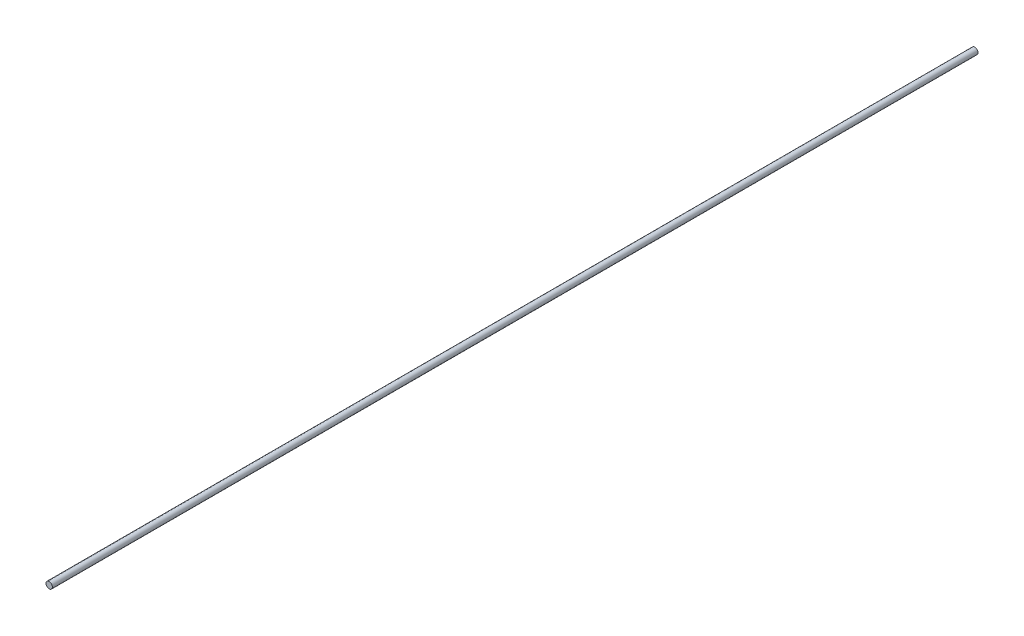
ISO-10303-21;
HEADER;
FILE_DESCRIPTION(('STEP AP214'),'2;1');
FILE_NAME('part.step','',(''),(''),'','','');
FILE_SCHEMA(('AUTOMOTIVE_DESIGN { 1 0 10303 214 1 1 1 1 }'));
ENDSEC;
DATA;
#1=APPLICATION_CONTEXT('core data for automotive mechanical design processes');
#2=APPLICATION_PROTOCOL_DEFINITION('international standard','automotive_design',2000,#1);
#3=PRODUCT_CONTEXT('',#1,'mechanical');
#4=PRODUCT('Part','Part','',(#3));
#5=PRODUCT_RELATED_PRODUCT_CATEGORY('part','',(#4));
#6=PRODUCT_DEFINITION_FORMATION('','',#4);
#7=PRODUCT_DEFINITION_CONTEXT('part definition',#1,'design');
#8=PRODUCT_DEFINITION('design','',#6,#7);
#9=PRODUCT_DEFINITION_SHAPE('','',#8);
#10=(LENGTH_UNIT() NAMED_UNIT(*) SI_UNIT(.MILLI.,.METRE.));
#11=(NAMED_UNIT(*) PLANE_ANGLE_UNIT() SI_UNIT($,.RADIAN.));
#12=(NAMED_UNIT(*) SI_UNIT($,.STERADIAN.) SOLID_ANGLE_UNIT());
#13=UNCERTAINTY_MEASURE_WITH_UNIT(LENGTH_MEASURE(1.E-05),#10,'distance_accuracy_value','');
#14=(GEOMETRIC_REPRESENTATION_CONTEXT(3) GLOBAL_UNCERTAINTY_ASSIGNED_CONTEXT((#13)) GLOBAL_UNIT_ASSIGNED_CONTEXT((#10,
#11,#12)) REPRESENTATION_CONTEXT('',''));
#15=CARTESIAN_POINT('',(0.,0.,0.));
#16=DIRECTION('',(0.,0.,1.));
#17=DIRECTION('',(1.,0.,0.));
#18=AXIS2_PLACEMENT_3D('',#15,#16,#17);
#19=CARTESIAN_POINT('',(0.,0.,290.));
#20=DIRECTION('',(0.,0.,-1.));
#21=DIRECTION('',(-1.,0.,0.));
#22=AXIS2_PLACEMENT_3D('',#19,#20,#21);
#23=CYLINDRICAL_SURFACE('',#22,1.);
#24=CARTESIAN_POINT('',(0.,0.,290.));
#25=DIRECTION('',(0.,0.,1.));
#26=DIRECTION('',(1.,0.,0.));
#27=AXIS2_PLACEMENT_3D('',#24,#25,#26);
#28=CIRCLE('',#27,1.);
#29=CARTESIAN_POINT('',(1.,0.,290.));
#30=VERTEX_POINT('',#29);
#31=EDGE_CURVE('E10',#30,#30,#28,.T.);
#32=ORIENTED_EDGE('',*,*,#31,.F.);
#33=EDGE_LOOP('',(#32));
#34=FACE_BOUND('',#33,.T.);
#35=CARTESIAN_POINT('',(0.,0.,0.));
#36=DIRECTION('',(0.,0.,1.));
#37=DIRECTION('',(1.,0.,0.));
#38=AXIS2_PLACEMENT_3D('',#35,#36,#37);
#39=CIRCLE('',#38,1.);
#40=CARTESIAN_POINT('',(1.,0.,0.));
#41=VERTEX_POINT('',#40);
#42=EDGE_CURVE('E34',#41,#41,#39,.T.);
#43=ORIENTED_EDGE('',*,*,#42,.T.);
#44=EDGE_LOOP('',(#43));
#45=FACE_BOUND('',#44,.T.);
#46=ADVANCED_FACE('F31',(#34,#45),#23,.T.);
#47=CARTESIAN_POINT('',(0.,0.,290.));
#48=DIRECTION('',(0.,0.,1.));
#49=DIRECTION('',(1.,0.,0.));
#50=AXIS2_PLACEMENT_3D('',#47,#48,#49);
#51=PLANE('',#50);
#52=ORIENTED_EDGE('',*,*,#31,.T.);
#53=EDGE_LOOP('',(#52));
#54=FACE_BOUND('',#53,.T.);
#55=ADVANCED_FACE('F46',(#54),#51,.T.);
#56=CARTESIAN_POINT('',(0.,0.,0.));
#57=DIRECTION('',(0.,0.,1.));
#58=DIRECTION('',(1.,0.,0.));
#59=AXIS2_PLACEMENT_3D('',#56,#57,#58);
#60=PLANE('',#59);
#61=ORIENTED_EDGE('',*,*,#42,.F.);
#62=EDGE_LOOP('',(#61));
#63=FACE_BOUND('',#62,.T.);
#64=ADVANCED_FACE('F44',(#63),#60,.F.);
#65=CLOSED_SHELL('',(#46,#55,#64));
#66=MANIFOLD_SOLID_BREP('B2',#65);
#67=ADVANCED_BREP_SHAPE_REPRESENTATION('',(#18,#66),#14);
#68=SHAPE_DEFINITION_REPRESENTATION(#9,#67);
ENDSEC;
END-ISO-10303-21;
